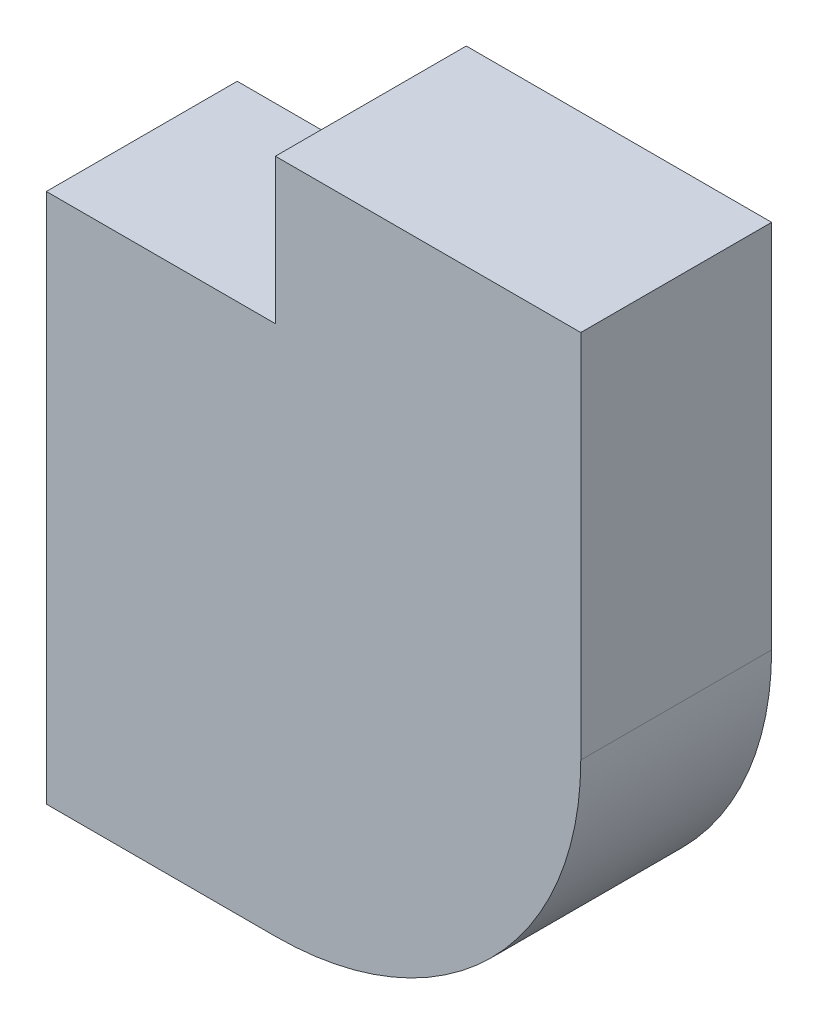
ISO-10303-21;
HEADER;
FILE_DESCRIPTION(('STEP AP214'),'2;1');
FILE_NAME('part.step','',(''),(''),'','','');
FILE_SCHEMA(('AUTOMOTIVE_DESIGN { 1 0 10303 214 1 1 1 1 }'));
ENDSEC;
DATA;
#1=APPLICATION_CONTEXT('core data for automotive mechanical design processes');
#2=APPLICATION_PROTOCOL_DEFINITION('international standard','automotive_design',2000,#1);
#3=PRODUCT_CONTEXT('',#1,'mechanical');
#4=PRODUCT('Part','Part','',(#3));
#5=PRODUCT_RELATED_PRODUCT_CATEGORY('part','',(#4));
#6=PRODUCT_DEFINITION_FORMATION('','',#4);
#7=PRODUCT_DEFINITION_CONTEXT('part definition',#1,'design');
#8=PRODUCT_DEFINITION('design','',#6,#7);
#9=PRODUCT_DEFINITION_SHAPE('','',#8);
#10=(LENGTH_UNIT() NAMED_UNIT(*) SI_UNIT(.MILLI.,.METRE.));
#11=(NAMED_UNIT(*) PLANE_ANGLE_UNIT() SI_UNIT($,.RADIAN.));
#12=(NAMED_UNIT(*) SI_UNIT($,.STERADIAN.) SOLID_ANGLE_UNIT());
#13=UNCERTAINTY_MEASURE_WITH_UNIT(LENGTH_MEASURE(1.E-05),#10,'distance_accuracy_value','');
#14=(GEOMETRIC_REPRESENTATION_CONTEXT(3) GLOBAL_UNCERTAINTY_ASSIGNED_CONTEXT((#13)) GLOBAL_UNIT_ASSIGNED_CONTEXT((#10,
#11,#12)) REPRESENTATION_CONTEXT('',''));
#15=CARTESIAN_POINT('',(0.,0.,0.));
#16=DIRECTION('',(0.,0.,1.));
#17=DIRECTION('',(1.,0.,0.));
#18=AXIS2_PLACEMENT_3D('',#15,#16,#17);
#19=CARTESIAN_POINT('',(0.7,0.,0.125));
#20=DIRECTION('',(0.,1.,0.));
#21=DIRECTION('',(-1.,0.,0.));
#22=AXIS2_PLACEMENT_3D('',#19,#20,#21);
#23=PLANE('',#22);
#24=DIRECTION('',(1.,0.,0.));
#25=VECTOR('',#24,1.);
#26=CARTESIAN_POINT('',(0.7,0.,-0.125));
#27=LINE('',#26,#25);
#28=CARTESIAN_POINT('',(0.,0.,-0.125));
#29=VERTEX_POINT('',#28);
#30=CARTESIAN_POINT('',(0.3,0.,-0.125));
#31=VERTEX_POINT('',#30);
#32=EDGE_CURVE('E125',#29,#31,#27,.T.);
#33=ORIENTED_EDGE('',*,*,#32,.T.);
#34=DIRECTION('',(0.,0.,-1.));
#35=VECTOR('',#34,1.);
#36=CARTESIAN_POINT('',(0.3,0.,0.125));
#37=LINE('',#36,#35);
#38=CARTESIAN_POINT('',(0.3,0.,0.125));
#39=VERTEX_POINT('',#38);
#40=EDGE_CURVE('E41',#31,#39,#37,.F.);
#41=ORIENTED_EDGE('',*,*,#40,.T.);
#42=DIRECTION('',(1.,0.,0.));
#43=VECTOR('',#42,1.);
#44=CARTESIAN_POINT('',(0.7,0.,0.125));
#45=LINE('',#44,#43);
#46=CARTESIAN_POINT('',(0.,0.,0.125));
#47=VERTEX_POINT('',#46);
#48=EDGE_CURVE('E101',#47,#39,#45,.T.);
#49=ORIENTED_EDGE('',*,*,#48,.F.);
#50=DIRECTION('',(0.,0.,-1.));
#51=VECTOR('',#50,1.);
#52=CARTESIAN_POINT('',(0.,0.,0.125));
#53=LINE('',#52,#51);
#54=EDGE_CURVE('E124',#47,#29,#53,.T.);
#55=ORIENTED_EDGE('',*,*,#54,.T.);
#56=EDGE_LOOP('',(#33,#41,#49,#55));
#57=FACE_BOUND('',#56,.T.);
#58=ADVANCED_FACE('F33',(#57),#23,.F.);
#59=CARTESIAN_POINT('',(0.7,0.885,0.125));
#60=DIRECTION('',(-1.,0.,0.));
#61=DIRECTION('',(0.,0.,1.));
#62=AXIS2_PLACEMENT_3D('',#59,#60,#61);
#63=PLANE('',#62);
#64=DIRECTION('',(0.,1.,0.));
#65=VECTOR('',#64,1.);
#66=CARTESIAN_POINT('',(0.7,0.695,0.125));
#67=LINE('',#66,#65);
#68=CARTESIAN_POINT('',(0.7,0.4,0.125));
#69=VERTEX_POINT('',#68);
#70=CARTESIAN_POINT('',(0.7,0.885,0.125));
#71=VERTEX_POINT('',#70);
#72=EDGE_CURVE('E91',#69,#71,#67,.T.);
#73=ORIENTED_EDGE('',*,*,#72,.F.);
#74=DIRECTION('',(0.,0.,-1.));
#75=VECTOR('',#74,1.);
#76=CARTESIAN_POINT('',(0.7,0.4,0.125));
#77=LINE('',#76,#75);
#78=CARTESIAN_POINT('',(0.7,0.4,-0.125));
#79=VERTEX_POINT('',#78);
#80=EDGE_CURVE('E109',#69,#79,#77,.T.);
#81=ORIENTED_EDGE('',*,*,#80,.T.);
#82=DIRECTION('',(0.,1.,0.));
#83=VECTOR('',#82,1.);
#84=CARTESIAN_POINT('',(0.7,0.885,-0.125));
#85=LINE('',#84,#83);
#86=CARTESIAN_POINT('',(0.7,0.885,-0.125));
#87=VERTEX_POINT('',#86);
#88=EDGE_CURVE('E106',#79,#87,#85,.T.);
#89=ORIENTED_EDGE('',*,*,#88,.T.);
#90=DIRECTION('',(0.,0.,-1.));
#91=VECTOR('',#90,1.);
#92=CARTESIAN_POINT('',(0.7,0.885,0.125));
#93=LINE('',#92,#91);
#94=EDGE_CURVE('E104',#71,#87,#93,.T.);
#95=ORIENTED_EDGE('',*,*,#94,.F.);
#96=EDGE_LOOP('',(#73,#81,#89,#95));
#97=FACE_BOUND('',#96,.T.);
#98=ADVANCED_FACE('F105',(#97),#63,.F.);
#99=CARTESIAN_POINT('',(0.3,0.885,0.125));
#100=DIRECTION('',(0.,-1.,0.));
#101=DIRECTION('',(0.,0.,-1.));
#102=AXIS2_PLACEMENT_3D('',#99,#100,#101);
#103=PLANE('',#102);
#104=DIRECTION('',(-1.,0.,0.));
#105=VECTOR('',#104,1.);
#106=CARTESIAN_POINT('',(0.3,0.885,-0.125));
#107=LINE('',#106,#105);
#108=CARTESIAN_POINT('',(0.3,0.885,-0.125));
#109=VERTEX_POINT('',#108);
#110=EDGE_CURVE('E128',#87,#109,#107,.T.);
#111=ORIENTED_EDGE('',*,*,#110,.T.);
#112=DIRECTION('',(0.,0.,-1.));
#113=VECTOR('',#112,1.);
#114=CARTESIAN_POINT('',(0.3,0.885,0.125));
#115=LINE('',#114,#113);
#116=CARTESIAN_POINT('',(0.3,0.885,0.125));
#117=VERTEX_POINT('',#116);
#118=EDGE_CURVE('E110',#117,#109,#115,.T.);
#119=ORIENTED_EDGE('',*,*,#118,.F.);
#120=DIRECTION('',(-1.,0.,0.));
#121=VECTOR('',#120,1.);
#122=CARTESIAN_POINT('',(0.3,0.885,0.125));
#123=LINE('',#122,#121);
#124=EDGE_CURVE('E95',#71,#117,#123,.T.);
#125=ORIENTED_EDGE('',*,*,#124,.F.);
#126=ORIENTED_EDGE('',*,*,#94,.T.);
#127=EDGE_LOOP('',(#111,#119,#125,#126));
#128=FACE_BOUND('',#127,.T.);
#129=ADVANCED_FACE('F112',(#128),#103,.F.);
#130=CARTESIAN_POINT('',(0.3,0.695,0.125));
#131=DIRECTION('',(1.,0.,0.));
#132=DIRECTION('',(0.,0.,-1.));
#133=AXIS2_PLACEMENT_3D('',#130,#131,#132);
#134=PLANE('',#133);
#135=DIRECTION('',(0.,-1.,0.));
#136=VECTOR('',#135,1.);
#137=CARTESIAN_POINT('',(0.3,0.695,-0.125));
#138=LINE('',#137,#136);
#139=CARTESIAN_POINT('',(0.3,0.695,-0.125));
#140=VERTEX_POINT('',#139);
#141=EDGE_CURVE('E130',#109,#140,#138,.T.);
#142=ORIENTED_EDGE('',*,*,#141,.T.);
#143=DIRECTION('',(0.,0.,-1.));
#144=VECTOR('',#143,1.);
#145=CARTESIAN_POINT('',(0.3,0.695,0.125));
#146=LINE('',#145,#144);
#147=CARTESIAN_POINT('',(0.3,0.695,0.125));
#148=VERTEX_POINT('',#147);
#149=EDGE_CURVE('E141',#148,#140,#146,.T.);
#150=ORIENTED_EDGE('',*,*,#149,.F.);
#151=DIRECTION('',(0.,-1.,0.));
#152=VECTOR('',#151,1.);
#153=CARTESIAN_POINT('',(0.3,0.695,0.125));
#154=LINE('',#153,#152);
#155=EDGE_CURVE('E115',#117,#148,#154,.T.);
#156=ORIENTED_EDGE('',*,*,#155,.F.);
#157=ORIENTED_EDGE('',*,*,#118,.T.);
#158=EDGE_LOOP('',(#142,#150,#156,#157));
#159=FACE_BOUND('',#158,.T.);
#160=ADVANCED_FACE('F151',(#159),#134,.F.);
#161=CARTESIAN_POINT('',(0.,0.695,0.125));
#162=DIRECTION('',(0.,-1.,0.));
#163=DIRECTION('',(0.,0.,-1.));
#164=AXIS2_PLACEMENT_3D('',#161,#162,#163);
#165=PLANE('',#164);
#166=DIRECTION('',(-1.,0.,0.));
#167=VECTOR('',#166,1.);
#168=CARTESIAN_POINT('',(0.,0.695,-0.125));
#169=LINE('',#168,#167);
#170=CARTESIAN_POINT('',(0.,0.695,-0.125));
#171=VERTEX_POINT('',#170);
#172=EDGE_CURVE('E132',#140,#171,#169,.T.);
#173=ORIENTED_EDGE('',*,*,#172,.T.);
#174=DIRECTION('',(0.,0.,-1.));
#175=VECTOR('',#174,1.);
#176=CARTESIAN_POINT('',(0.,0.695,0.125));
#177=LINE('',#176,#175);
#178=CARTESIAN_POINT('',(0.,0.695,0.125));
#179=VERTEX_POINT('',#178);
#180=EDGE_CURVE('E138',#179,#171,#177,.T.);
#181=ORIENTED_EDGE('',*,*,#180,.F.);
#182=DIRECTION('',(-1.,0.,0.));
#183=VECTOR('',#182,1.);
#184=CARTESIAN_POINT('',(0.,0.695,0.125));
#185=LINE('',#184,#183);
#186=EDGE_CURVE('E117',#148,#179,#185,.T.);
#187=ORIENTED_EDGE('',*,*,#186,.F.);
#188=ORIENTED_EDGE('',*,*,#149,.T.);
#189=EDGE_LOOP('',(#173,#181,#187,#188));
#190=FACE_BOUND('',#189,.T.);
#191=ADVANCED_FACE('F158',(#190),#165,.F.);
#192=CARTESIAN_POINT('',(0.,0.,0.125));
#193=DIRECTION('',(1.,0.,0.));
#194=DIRECTION('',(0.,0.,-1.));
#195=AXIS2_PLACEMENT_3D('',#192,#193,#194);
#196=PLANE('',#195);
#197=DIRECTION('',(0.,-1.,0.));
#198=VECTOR('',#197,1.);
#199=CARTESIAN_POINT('',(0.,0.,-0.125));
#200=LINE('',#199,#198);
#201=EDGE_CURVE('E134',#171,#29,#200,.T.);
#202=ORIENTED_EDGE('',*,*,#201,.T.);
#203=ORIENTED_EDGE('',*,*,#54,.F.);
#204=DIRECTION('',(0.,-1.,0.));
#205=VECTOR('',#204,1.);
#206=CARTESIAN_POINT('',(0.,0.,0.125));
#207=LINE('',#206,#205);
#208=EDGE_CURVE('E122',#179,#47,#207,.T.);
#209=ORIENTED_EDGE('',*,*,#208,.F.);
#210=ORIENTED_EDGE('',*,*,#180,.T.);
#211=EDGE_LOOP('',(#202,#203,#209,#210));
#212=FACE_BOUND('',#211,.T.);
#213=ADVANCED_FACE('F161',(#212),#196,.F.);
#214=CARTESIAN_POINT('',(0.,0.,0.125));
#215=DIRECTION('',(0.,0.,-1.));
#216=DIRECTION('',(-1.,0.,0.));
#217=AXIS2_PLACEMENT_3D('',#214,#215,#216);
#218=PLANE('',#217);
#219=ORIENTED_EDGE('',*,*,#48,.T.);
#220=CARTESIAN_POINT('',(0.3,0.4,0.125));
#221=DIRECTION('',(0.,0.,-1.));
#222=DIRECTION('',(-1.,0.,0.));
#223=AXIS2_PLACEMENT_3D('',#220,#221,#222);
#224=CIRCLE('',#223,0.4);
#225=EDGE_CURVE('E11',#39,#69,#224,.F.);
#226=ORIENTED_EDGE('',*,*,#225,.T.);
#227=ORIENTED_EDGE('',*,*,#72,.T.);
#228=ORIENTED_EDGE('',*,*,#124,.T.);
#229=ORIENTED_EDGE('',*,*,#155,.T.);
#230=ORIENTED_EDGE('',*,*,#186,.T.);
#231=ORIENTED_EDGE('',*,*,#208,.T.);
#232=EDGE_LOOP('',(#219,#226,#227,#228,#229,#230,#231));
#233=FACE_BOUND('',#232,.T.);
#234=ADVANCED_FACE('F93',(#233),#218,.F.);
#235=CARTESIAN_POINT('',(0.,0.,-0.125));
#236=DIRECTION('',(0.,0.,-1.));
#237=DIRECTION('',(-1.,0.,0.));
#238=AXIS2_PLACEMENT_3D('',#235,#236,#237);
#239=PLANE('',#238);
#240=ORIENTED_EDGE('',*,*,#88,.F.);
#241=CARTESIAN_POINT('',(0.3,0.4,-0.125));
#242=DIRECTION('',(0.,0.,-1.));
#243=DIRECTION('',(-1.,0.,0.));
#244=AXIS2_PLACEMENT_3D('',#241,#242,#243);
#245=CIRCLE('',#244,0.4);
#246=EDGE_CURVE('E55',#79,#31,#245,.T.);
#247=ORIENTED_EDGE('',*,*,#246,.T.);
#248=ORIENTED_EDGE('',*,*,#32,.F.);
#249=ORIENTED_EDGE('',*,*,#201,.F.);
#250=ORIENTED_EDGE('',*,*,#172,.F.);
#251=ORIENTED_EDGE('',*,*,#141,.F.);
#252=ORIENTED_EDGE('',*,*,#110,.F.);
#253=EDGE_LOOP('',(#240,#247,#248,#249,#250,#251,#252));
#254=FACE_BOUND('',#253,.T.);
#255=ADVANCED_FACE('F147',(#254),#239,.T.);
#256=CARTESIAN_POINT('',(0.3,0.4,0.125));
#257=DIRECTION('',(0.,0.,-1.));
#258=DIRECTION('',(-1.,0.,0.));
#259=AXIS2_PLACEMENT_3D('',#256,#257,#258);
#260=CYLINDRICAL_SURFACE('',#259,0.4);
#261=ORIENTED_EDGE('',*,*,#225,.F.);
#262=ORIENTED_EDGE('',*,*,#40,.F.);
#263=ORIENTED_EDGE('',*,*,#246,.F.);
#264=ORIENTED_EDGE('',*,*,#80,.F.);
#265=EDGE_LOOP('',(#261,#262,#263,#264));
#266=FACE_BOUND('',#265,.T.);
#267=ADVANCED_FACE('F35',(#266),#260,.T.);
#268=CLOSED_SHELL('',(#58,#98,#129,#160,#191,#213,#234,#255,#267));
#269=MANIFOLD_SOLID_BREP('B2',#268);
#270=ADVANCED_BREP_SHAPE_REPRESENTATION('',(#18,#269),#14);
#271=SHAPE_DEFINITION_REPRESENTATION(#9,#270);
ENDSEC;
END-ISO-10303-21;
